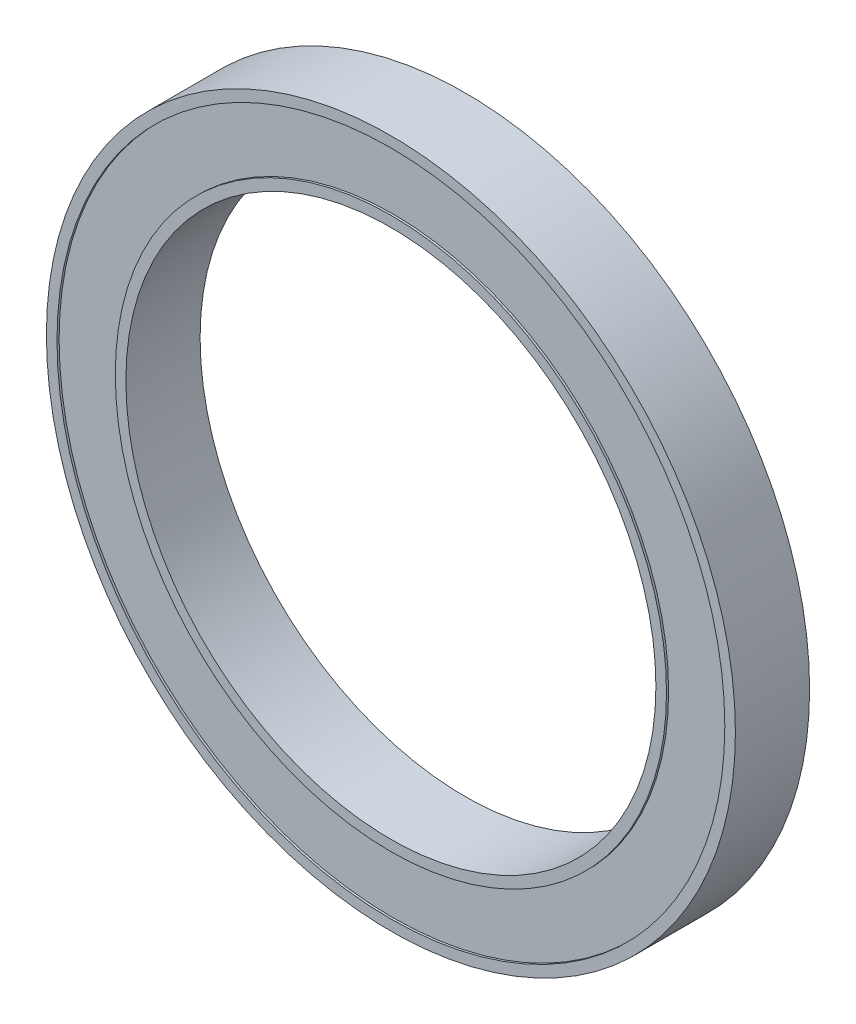
ISO-10303-21;
HEADER;
FILE_DESCRIPTION(('STEP AP214'),'2;1');
FILE_NAME('part.step','',(''),(''),'','','');
FILE_SCHEMA(('AUTOMOTIVE_DESIGN { 1 0 10303 214 1 1 1 1 }'));
ENDSEC;
DATA;
#1=APPLICATION_CONTEXT('core data for automotive mechanical design processes');
#2=APPLICATION_PROTOCOL_DEFINITION('international standard','automotive_design',2000,#1);
#3=PRODUCT_CONTEXT('',#1,'mechanical');
#4=PRODUCT('Part','Part','',(#3));
#5=PRODUCT_RELATED_PRODUCT_CATEGORY('part','',(#4));
#6=PRODUCT_DEFINITION_FORMATION('','',#4);
#7=PRODUCT_DEFINITION_CONTEXT('part definition',#1,'design');
#8=PRODUCT_DEFINITION('design','',#6,#7);
#9=PRODUCT_DEFINITION_SHAPE('','',#8);
#10=(LENGTH_UNIT() NAMED_UNIT(*) SI_UNIT(.MILLI.,.METRE.));
#11=(NAMED_UNIT(*) PLANE_ANGLE_UNIT() SI_UNIT($,.RADIAN.));
#12=(NAMED_UNIT(*) SI_UNIT($,.STERADIAN.) SOLID_ANGLE_UNIT());
#13=UNCERTAINTY_MEASURE_WITH_UNIT(LENGTH_MEASURE(1.E-05),#10,'distance_accuracy_value','');
#14=(GEOMETRIC_REPRESENTATION_CONTEXT(3) GLOBAL_UNCERTAINTY_ASSIGNED_CONTEXT((#13)) GLOBAL_UNIT_ASSIGNED_CONTEXT((#10,
#11,#12)) REPRESENTATION_CONTEXT('',''));
#15=CARTESIAN_POINT('',(0.,0.,0.));
#16=DIRECTION('',(0.,0.,1.));
#17=DIRECTION('',(1.,0.,0.));
#18=AXIS2_PLACEMENT_3D('',#15,#16,#17);
#19=CARTESIAN_POINT('',(0.,0.,7.));
#20=DIRECTION('',(0.,0.,-1.));
#21=DIRECTION('',(-1.,0.,0.));
#22=AXIS2_PLACEMENT_3D('',#19,#20,#21);
#23=CYLINDRICAL_SURFACE('',#22,26.);
#24=CARTESIAN_POINT('',(0.,0.,0.));
#25=DIRECTION('',(0.,0.,1.));
#26=DIRECTION('',(1.,0.,0.));
#27=AXIS2_PLACEMENT_3D('',#24,#25,#26);
#28=CIRCLE('',#27,26.);
#29=CARTESIAN_POINT('',(26.,0.,0.));
#30=VERTEX_POINT('',#29);
#31=EDGE_CURVE('E53',#30,#30,#28,.T.);
#32=ORIENTED_EDGE('',*,*,#31,.T.);
#33=EDGE_LOOP('',(#32));
#34=FACE_BOUND('',#33,.T.);
#35=CARTESIAN_POINT('',(0.,0.,0.2));
#36=DIRECTION('',(0.,0.,1.));
#37=DIRECTION('',(1.,0.,0.));
#38=AXIS2_PLACEMENT_3D('',#35,#36,#37);
#39=CIRCLE('',#38,26.);
#40=CARTESIAN_POINT('',(26.,0.,0.2));
#41=VERTEX_POINT('',#40);
#42=EDGE_CURVE('E11',#41,#41,#39,.T.);
#43=ORIENTED_EDGE('',*,*,#42,.F.);
#44=EDGE_LOOP('',(#43));
#45=FACE_BOUND('',#44,.T.);
#46=ADVANCED_FACE('F37',(#34,#45),#23,.T.);
#47=CARTESIAN_POINT('',(0.,0.,7.));
#48=DIRECTION('',(0.,0.,-1.));
#49=DIRECTION('',(-1.,0.,0.));
#50=AXIS2_PLACEMENT_3D('',#47,#48,#49);
#51=CYLINDRICAL_SURFACE('',#50,25.);
#52=CARTESIAN_POINT('',(0.,0.,7.));
#53=DIRECTION('',(0.,0.,1.));
#54=DIRECTION('',(1.,0.,0.));
#55=AXIS2_PLACEMENT_3D('',#52,#53,#54);
#56=CIRCLE('',#55,25.);
#57=CARTESIAN_POINT('',(25.,0.,7.));
#58=VERTEX_POINT('',#57);
#59=EDGE_CURVE('E48',#58,#58,#56,.T.);
#60=ORIENTED_EDGE('',*,*,#59,.T.);
#61=EDGE_LOOP('',(#60));
#62=FACE_BOUND('',#61,.T.);
#63=CARTESIAN_POINT('',(0.,0.,0.));
#64=DIRECTION('',(0.,0.,1.));
#65=DIRECTION('',(1.,0.,0.));
#66=AXIS2_PLACEMENT_3D('',#63,#64,#65);
#67=CIRCLE('',#66,25.);
#68=CARTESIAN_POINT('',(25.,0.,0.));
#69=VERTEX_POINT('',#68);
#70=EDGE_CURVE('E57',#69,#69,#67,.T.);
#71=ORIENTED_EDGE('',*,*,#70,.F.);
#72=EDGE_LOOP('',(#71));
#73=FACE_BOUND('',#72,.T.);
#74=ADVANCED_FACE('F39',(#62,#73),#51,.F.);
#75=CARTESIAN_POINT('',(0.,0.,6.8));
#76=DIRECTION('',(0.,0.,1.));
#77=DIRECTION('',(1.,0.,0.));
#78=AXIS2_PLACEMENT_3D('',#75,#76,#77);
#79=CIRCLE('',#78,26.);
#80=CARTESIAN_POINT('',(26.,0.,6.8));
#81=VERTEX_POINT('',#80);
#82=EDGE_CURVE('E59',#81,#81,#79,.T.);
#83=ORIENTED_EDGE('',*,*,#82,.T.);
#84=EDGE_LOOP('',(#83));
#85=FACE_BOUND('',#84,.T.);
#86=CARTESIAN_POINT('',(0.,0.,7.));
#87=DIRECTION('',(0.,0.,1.));
#88=DIRECTION('',(1.,0.,0.));
#89=AXIS2_PLACEMENT_3D('',#86,#87,#88);
#90=CIRCLE('',#89,26.);
#91=CARTESIAN_POINT('',(26.,0.,7.));
#92=VERTEX_POINT('',#91);
#93=EDGE_CURVE('E44',#92,#92,#90,.T.);
#94=ORIENTED_EDGE('',*,*,#93,.F.);
#95=EDGE_LOOP('',(#94));
#96=FACE_BOUND('',#95,.T.);
#97=ADVANCED_FACE('F78',(#85,#96),#23,.T.);
#98=CARTESIAN_POINT('',(0.,0.,7.));
#99=DIRECTION('',(0.,0.,1.));
#100=DIRECTION('',(1.,0.,0.));
#101=AXIS2_PLACEMENT_3D('',#98,#99,#100);
#102=PLANE('',#101);
#103=ORIENTED_EDGE('',*,*,#59,.F.);
#104=EDGE_LOOP('',(#103));
#105=FACE_BOUND('',#104,.T.);
#106=ORIENTED_EDGE('',*,*,#93,.T.);
#107=EDGE_LOOP('',(#106));
#108=FACE_BOUND('',#107,.T.);
#109=ADVANCED_FACE('F68',(#105,#108),#102,.T.);
#110=CARTESIAN_POINT('',(0.,0.,0.));
#111=DIRECTION('',(0.,0.,1.));
#112=DIRECTION('',(1.,0.,0.));
#113=AXIS2_PLACEMENT_3D('',#110,#111,#112);
#114=PLANE('',#113);
#115=ORIENTED_EDGE('',*,*,#70,.T.);
#116=EDGE_LOOP('',(#115));
#117=FACE_BOUND('',#116,.T.);
#118=ORIENTED_EDGE('',*,*,#31,.F.);
#119=EDGE_LOOP('',(#118));
#120=FACE_BOUND('',#119,.T.);
#121=ADVANCED_FACE('F65',(#117,#120),#114,.F.);
#122=CARTESIAN_POINT('',(0.,0.,6.8));
#123=DIRECTION('',(0.,0.,1.));
#124=DIRECTION('',(1.,0.,0.));
#125=AXIS2_PLACEMENT_3D('',#122,#123,#124);
#126=PLANE('',#125);
#127=ORIENTED_EDGE('',*,*,#82,.F.);
#128=EDGE_LOOP('',(#127));
#129=FACE_BOUND('',#128,.T.);
#130=CARTESIAN_POINT('',(0.,0.,6.8));
#131=DIRECTION('',(0.,0.,1.));
#132=DIRECTION('',(1.,0.,0.));
#133=AXIS2_PLACEMENT_3D('',#130,#131,#132);
#134=CIRCLE('',#133,31.5);
#135=CARTESIAN_POINT('',(31.5,0.,6.8));
#136=VERTEX_POINT('',#135);
#137=EDGE_CURVE('E96',#136,#136,#134,.F.);
#138=ORIENTED_EDGE('',*,*,#137,.F.);
#139=EDGE_LOOP('',(#138));
#140=FACE_BOUND('',#139,.T.);
#141=ADVANCED_FACE('F67',(#129,#140),#126,.T.);
#142=CARTESIAN_POINT('',(0.,0.,0.2));
#143=DIRECTION('',(0.,0.,1.));
#144=DIRECTION('',(1.,0.,0.));
#145=AXIS2_PLACEMENT_3D('',#142,#143,#144);
#146=PLANE('',#145);
#147=ORIENTED_EDGE('',*,*,#42,.T.);
#148=EDGE_LOOP('',(#147));
#149=FACE_BOUND('',#148,.T.);
#150=CARTESIAN_POINT('',(0.,0.,0.2));
#151=DIRECTION('',(0.,0.,1.));
#152=DIRECTION('',(1.,0.,0.));
#153=AXIS2_PLACEMENT_3D('',#150,#151,#152);
#154=CIRCLE('',#153,31.5);
#155=CARTESIAN_POINT('',(31.5,0.,0.2));
#156=VERTEX_POINT('',#155);
#157=EDGE_CURVE('E93',#156,#156,#154,.T.);
#158=ORIENTED_EDGE('',*,*,#157,.F.);
#159=EDGE_LOOP('',(#158));
#160=FACE_BOUND('',#159,.T.);
#161=ADVANCED_FACE('F75',(#149,#160),#146,.F.);
#162=CARTESIAN_POINT('',(0.,0.,7.));
#163=DIRECTION('',(0.,0.,-1.));
#164=DIRECTION('',(-1.,0.,0.));
#165=AXIS2_PLACEMENT_3D('',#162,#163,#164);
#166=CYLINDRICAL_SURFACE('',#165,31.5);
#167=CARTESIAN_POINT('',(0.,0.,0.));
#168=DIRECTION('',(0.,0.,1.));
#169=DIRECTION('',(1.,0.,0.));
#170=AXIS2_PLACEMENT_3D('',#167,#168,#169);
#171=CIRCLE('',#170,31.5);
#172=CARTESIAN_POINT('',(31.5,0.,0.));
#173=VERTEX_POINT('',#172);
#174=EDGE_CURVE('E105',#173,#173,#171,.T.);
#175=ORIENTED_EDGE('',*,*,#174,.F.);
#176=EDGE_LOOP('',(#175));
#177=FACE_BOUND('',#176,.T.);
#178=ORIENTED_EDGE('',*,*,#157,.T.);
#179=EDGE_LOOP('',(#178));
#180=FACE_BOUND('',#179,.T.);
#181=ADVANCED_FACE('F135',(#177,#180),#166,.F.);
#182=ORIENTED_EDGE('',*,*,#137,.T.);
#183=EDGE_LOOP('',(#182));
#184=FACE_BOUND('',#183,.T.);
#185=CARTESIAN_POINT('',(0.,0.,7.));
#186=DIRECTION('',(0.,0.,1.));
#187=DIRECTION('',(1.,0.,0.));
#188=AXIS2_PLACEMENT_3D('',#185,#186,#187);
#189=CIRCLE('',#188,31.5);
#190=CARTESIAN_POINT('',(31.5,0.,7.));
#191=VERTEX_POINT('',#190);
#192=EDGE_CURVE('E104',#191,#191,#189,.T.);
#193=ORIENTED_EDGE('',*,*,#192,.T.);
#194=EDGE_LOOP('',(#193));
#195=FACE_BOUND('',#194,.T.);
#196=ADVANCED_FACE('F113',(#184,#195),#166,.F.);
#197=CARTESIAN_POINT('',(0.,0.,7.));
#198=DIRECTION('',(0.,0.,-1.));
#199=DIRECTION('',(-1.,0.,0.));
#200=AXIS2_PLACEMENT_3D('',#197,#198,#199);
#201=CYLINDRICAL_SURFACE('',#200,32.5);
#202=CARTESIAN_POINT('',(0.,0.,7.));
#203=DIRECTION('',(0.,0.,1.));
#204=DIRECTION('',(1.,0.,0.));
#205=AXIS2_PLACEMENT_3D('',#202,#203,#204);
#206=CIRCLE('',#205,32.5);
#207=CARTESIAN_POINT('',(32.5,0.,7.));
#208=VERTEX_POINT('',#207);
#209=EDGE_CURVE('E100',#208,#208,#206,.T.);
#210=ORIENTED_EDGE('',*,*,#209,.F.);
#211=EDGE_LOOP('',(#210));
#212=FACE_BOUND('',#211,.T.);
#213=CARTESIAN_POINT('',(0.,0.,0.));
#214=DIRECTION('',(0.,0.,1.));
#215=DIRECTION('',(1.,0.,0.));
#216=AXIS2_PLACEMENT_3D('',#213,#214,#215);
#217=CIRCLE('',#216,32.5);
#218=CARTESIAN_POINT('',(32.5,0.,0.));
#219=VERTEX_POINT('',#218);
#220=EDGE_CURVE('E101',#219,#219,#217,.T.);
#221=ORIENTED_EDGE('',*,*,#220,.T.);
#222=EDGE_LOOP('',(#221));
#223=FACE_BOUND('',#222,.T.);
#224=ADVANCED_FACE('F119',(#212,#223),#201,.T.);
#225=CARTESIAN_POINT('',(0.,0.,7.));
#226=DIRECTION('',(0.,0.,1.));
#227=DIRECTION('',(1.,0.,0.));
#228=AXIS2_PLACEMENT_3D('',#225,#226,#227);
#229=PLANE('',#228);
#230=ORIENTED_EDGE('',*,*,#192,.F.);
#231=EDGE_LOOP('',(#230));
#232=FACE_BOUND('',#231,.T.);
#233=ORIENTED_EDGE('',*,*,#209,.T.);
#234=EDGE_LOOP('',(#233));
#235=FACE_BOUND('',#234,.T.);
#236=ADVANCED_FACE('F115',(#232,#235),#229,.T.);
#237=CARTESIAN_POINT('',(0.,0.,0.));
#238=DIRECTION('',(0.,0.,1.));
#239=DIRECTION('',(1.,0.,0.));
#240=AXIS2_PLACEMENT_3D('',#237,#238,#239);
#241=PLANE('',#240);
#242=ORIENTED_EDGE('',*,*,#174,.T.);
#243=EDGE_LOOP('',(#242));
#244=FACE_BOUND('',#243,.T.);
#245=ORIENTED_EDGE('',*,*,#220,.F.);
#246=EDGE_LOOP('',(#245));
#247=FACE_BOUND('',#246,.T.);
#248=ADVANCED_FACE('F118',(#244,#247),#241,.F.);
#249=CLOSED_SHELL('',(#46,#74,#97,#109,#121,#141,#161,#181,#196,#224,#236,#248));
#250=MANIFOLD_SOLID_BREP('B2',#249);
#251=ADVANCED_BREP_SHAPE_REPRESENTATION('',(#18,#250),#14);
#252=SHAPE_DEFINITION_REPRESENTATION(#9,#251);
ENDSEC;
END-ISO-10303-21;
